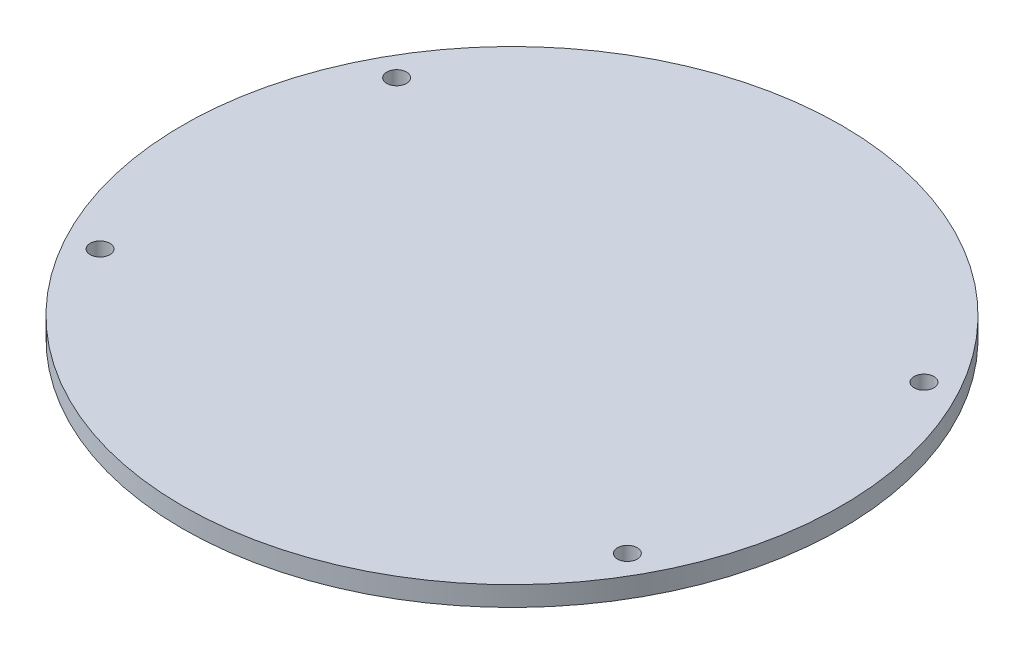
ISO-10303-21;
HEADER;
FILE_DESCRIPTION(('STEP AP214'),'2;1');
FILE_NAME('part.step','',(''),(''),'','','');
FILE_SCHEMA(('AUTOMOTIVE_DESIGN { 1 0 10303 214 1 1 1 1 }'));
ENDSEC;
DATA;
#1=APPLICATION_CONTEXT('core data for automotive mechanical design processes');
#2=APPLICATION_PROTOCOL_DEFINITION('international standard','automotive_design',2000,#1);
#3=PRODUCT_CONTEXT('',#1,'mechanical');
#4=PRODUCT('Part','Part','',(#3));
#5=PRODUCT_RELATED_PRODUCT_CATEGORY('part','',(#4));
#6=PRODUCT_DEFINITION_FORMATION('','',#4);
#7=PRODUCT_DEFINITION_CONTEXT('part definition',#1,'design');
#8=PRODUCT_DEFINITION('design','',#6,#7);
#9=PRODUCT_DEFINITION_SHAPE('','',#8);
#10=(LENGTH_UNIT() NAMED_UNIT(*) SI_UNIT(.MILLI.,.METRE.));
#11=(NAMED_UNIT(*) PLANE_ANGLE_UNIT() SI_UNIT($,.RADIAN.));
#12=(NAMED_UNIT(*) SI_UNIT($,.STERADIAN.) SOLID_ANGLE_UNIT());
#13=UNCERTAINTY_MEASURE_WITH_UNIT(LENGTH_MEASURE(1.E-05),#10,'distance_accuracy_value','');
#14=(GEOMETRIC_REPRESENTATION_CONTEXT(3) GLOBAL_UNCERTAINTY_ASSIGNED_CONTEXT((#13)) GLOBAL_UNIT_ASSIGNED_CONTEXT((#10,
#11,#12)) REPRESENTATION_CONTEXT('',''));
#15=CARTESIAN_POINT('',(0.,0.,0.));
#16=DIRECTION('',(0.,0.,1.));
#17=DIRECTION('',(1.,0.,0.));
#18=AXIS2_PLACEMENT_3D('',#15,#16,#17);
#19=CARTESIAN_POINT('',(0.,3.,0.));
#20=DIRECTION('',(0.,1.,0.));
#21=DIRECTION('',(0.,0.,1.));
#22=AXIS2_PLACEMENT_3D('',#19,#20,#21);
#23=PLANE('',#22);
#24=CARTESIAN_POINT('',(40.,3.,22.5));
#25=DIRECTION('',(0.,1.,0.));
#26=DIRECTION('',(0.,0.,1.));
#27=AXIS2_PLACEMENT_3D('',#24,#25,#26);
#28=CIRCLE('',#27,1.5);
#29=CARTESIAN_POINT('',(40.,3.,24.));
#30=VERTEX_POINT('',#29);
#31=EDGE_CURVE('E56',#30,#30,#28,.T.);
#32=ORIENTED_EDGE('',*,*,#31,.F.);
#33=EDGE_LOOP('',(#32));
#34=FACE_BOUND('',#33,.T.);
#35=CARTESIAN_POINT('',(-40.,3.,-22.5));
#36=DIRECTION('',(0.,1.,0.));
#37=DIRECTION('',(0.,0.,1.));
#38=AXIS2_PLACEMENT_3D('',#35,#36,#37);
#39=CIRCLE('',#38,1.5);
#40=CARTESIAN_POINT('',(-40.,3.,-21.));
#41=VERTEX_POINT('',#40);
#42=EDGE_CURVE('E45',#41,#41,#39,.T.);
#43=ORIENTED_EDGE('',*,*,#42,.F.);
#44=EDGE_LOOP('',(#43));
#45=FACE_BOUND('',#44,.T.);
#46=CARTESIAN_POINT('',(0.,3.,0.));
#47=DIRECTION('',(0.,1.,0.));
#48=DIRECTION('',(0.,0.,1.));
#49=AXIS2_PLACEMENT_3D('',#46,#47,#48);
#50=CIRCLE('',#49,50.);
#51=CARTESIAN_POINT('',(0.,3.,50.));
#52=VERTEX_POINT('',#51);
#53=EDGE_CURVE('E10',#52,#52,#50,.T.);
#54=ORIENTED_EDGE('',*,*,#53,.T.);
#55=EDGE_LOOP('',(#54));
#56=FACE_BOUND('',#55,.T.);
#57=CARTESIAN_POINT('',(40.,3.,-22.5));
#58=DIRECTION('',(0.,1.,0.));
#59=DIRECTION('',(0.,0.,1.));
#60=AXIS2_PLACEMENT_3D('',#57,#58,#59);
#61=CIRCLE('',#60,1.5);
#62=CARTESIAN_POINT('',(40.,3.,-21.));
#63=VERTEX_POINT('',#62);
#64=EDGE_CURVE('E50',#63,#63,#61,.T.);
#65=ORIENTED_EDGE('',*,*,#64,.F.);
#66=EDGE_LOOP('',(#65));
#67=FACE_BOUND('',#66,.T.);
#68=CARTESIAN_POINT('',(-40.,3.,22.5));
#69=DIRECTION('',(0.,1.,0.));
#70=DIRECTION('',(0.,0.,1.));
#71=AXIS2_PLACEMENT_3D('',#68,#69,#70);
#72=CIRCLE('',#71,1.5);
#73=CARTESIAN_POINT('',(-40.,3.,24.));
#74=VERTEX_POINT('',#73);
#75=EDGE_CURVE('E62',#74,#74,#72,.T.);
#76=ORIENTED_EDGE('',*,*,#75,.F.);
#77=EDGE_LOOP('',(#76));
#78=FACE_BOUND('',#77,.T.);
#79=ADVANCED_FACE('F34',(#34,#45,#56,#67,#78),#23,.T.);
#80=CARTESIAN_POINT('',(0.,0.,0.));
#81=DIRECTION('',(0.,1.,0.));
#82=DIRECTION('',(0.,0.,1.));
#83=AXIS2_PLACEMENT_3D('',#80,#81,#82);
#84=PLANE('',#83);
#85=CARTESIAN_POINT('',(0.,0.,0.));
#86=DIRECTION('',(0.,1.,0.));
#87=DIRECTION('',(0.,0.,1.));
#88=AXIS2_PLACEMENT_3D('',#85,#86,#87);
#89=CIRCLE('',#88,50.);
#90=CARTESIAN_POINT('',(0.,0.,50.));
#91=VERTEX_POINT('',#90);
#92=EDGE_CURVE('E38',#91,#91,#89,.T.);
#93=ORIENTED_EDGE('',*,*,#92,.F.);
#94=EDGE_LOOP('',(#93));
#95=FACE_BOUND('',#94,.T.);
#96=CARTESIAN_POINT('',(-40.,0.,-22.5));
#97=DIRECTION('',(0.,1.,0.));
#98=DIRECTION('',(0.,0.,1.));
#99=AXIS2_PLACEMENT_3D('',#96,#97,#98);
#100=CIRCLE('',#99,1.5);
#101=CARTESIAN_POINT('',(-40.,0.,-21.));
#102=VERTEX_POINT('',#101);
#103=EDGE_CURVE('E47',#102,#102,#100,.T.);
#104=ORIENTED_EDGE('',*,*,#103,.T.);
#105=EDGE_LOOP('',(#104));
#106=FACE_BOUND('',#105,.T.);
#107=CARTESIAN_POINT('',(40.,0.,-22.5));
#108=DIRECTION('',(0.,1.,0.));
#109=DIRECTION('',(0.,0.,1.));
#110=AXIS2_PLACEMENT_3D('',#107,#108,#109);
#111=CIRCLE('',#110,1.5);
#112=CARTESIAN_POINT('',(40.,0.,-21.));
#113=VERTEX_POINT('',#112);
#114=EDGE_CURVE('E53',#113,#113,#111,.T.);
#115=ORIENTED_EDGE('',*,*,#114,.T.);
#116=EDGE_LOOP('',(#115));
#117=FACE_BOUND('',#116,.T.);
#118=CARTESIAN_POINT('',(40.,0.,22.5));
#119=DIRECTION('',(0.,1.,0.));
#120=DIRECTION('',(0.,0.,1.));
#121=AXIS2_PLACEMENT_3D('',#118,#119,#120);
#122=CIRCLE('',#121,1.5);
#123=CARTESIAN_POINT('',(40.,0.,24.));
#124=VERTEX_POINT('',#123);
#125=EDGE_CURVE('E59',#124,#124,#122,.T.);
#126=ORIENTED_EDGE('',*,*,#125,.T.);
#127=EDGE_LOOP('',(#126));
#128=FACE_BOUND('',#127,.T.);
#129=CARTESIAN_POINT('',(-40.,0.,22.5));
#130=DIRECTION('',(0.,1.,0.));
#131=DIRECTION('',(0.,0.,1.));
#132=AXIS2_PLACEMENT_3D('',#129,#130,#131);
#133=CIRCLE('',#132,1.5);
#134=CARTESIAN_POINT('',(-40.,0.,24.));
#135=VERTEX_POINT('',#134);
#136=EDGE_CURVE('E65',#135,#135,#133,.T.);
#137=ORIENTED_EDGE('',*,*,#136,.T.);
#138=EDGE_LOOP('',(#137));
#139=FACE_BOUND('',#138,.T.);
#140=ADVANCED_FACE('F75',(#95,#106,#117,#128,#139),#84,.F.);
#141=CARTESIAN_POINT('',(0.,3.,0.));
#142=DIRECTION('',(0.,-1.,0.));
#143=DIRECTION('',(0.,0.,-1.));
#144=AXIS2_PLACEMENT_3D('',#141,#142,#143);
#145=CYLINDRICAL_SURFACE('',#144,50.);
#146=ORIENTED_EDGE('',*,*,#53,.F.);
#147=EDGE_LOOP('',(#146));
#148=FACE_BOUND('',#147,.T.);
#149=ORIENTED_EDGE('',*,*,#92,.T.);
#150=EDGE_LOOP('',(#149));
#151=FACE_BOUND('',#150,.T.);
#152=ADVANCED_FACE('F36',(#148,#151),#145,.T.);
#153=CARTESIAN_POINT('',(-40.,3.,-22.5));
#154=DIRECTION('',(0.,-1.,0.));
#155=DIRECTION('',(0.,0.,-1.));
#156=AXIS2_PLACEMENT_3D('',#153,#154,#155);
#157=CYLINDRICAL_SURFACE('',#156,1.5);
#158=ORIENTED_EDGE('',*,*,#42,.T.);
#159=EDGE_LOOP('',(#158));
#160=FACE_BOUND('',#159,.T.);
#161=ORIENTED_EDGE('',*,*,#103,.F.);
#162=EDGE_LOOP('',(#161));
#163=FACE_BOUND('',#162,.T.);
#164=ADVANCED_FACE('F85',(#160,#163),#157,.F.);
#165=CARTESIAN_POINT('',(40.,3.,-22.5));
#166=DIRECTION('',(0.,-1.,0.));
#167=DIRECTION('',(0.,0.,-1.));
#168=AXIS2_PLACEMENT_3D('',#165,#166,#167);
#169=CYLINDRICAL_SURFACE('',#168,1.5);
#170=ORIENTED_EDGE('',*,*,#64,.T.);
#171=EDGE_LOOP('',(#170));
#172=FACE_BOUND('',#171,.T.);
#173=ORIENTED_EDGE('',*,*,#114,.F.);
#174=EDGE_LOOP('',(#173));
#175=FACE_BOUND('',#174,.T.);
#176=ADVANCED_FACE('F88',(#172,#175),#169,.F.);
#177=CARTESIAN_POINT('',(40.,3.,22.5));
#178=DIRECTION('',(0.,-1.,0.));
#179=DIRECTION('',(0.,0.,-1.));
#180=AXIS2_PLACEMENT_3D('',#177,#178,#179);
#181=CYLINDRICAL_SURFACE('',#180,1.5);
#182=ORIENTED_EDGE('',*,*,#31,.T.);
#183=EDGE_LOOP('',(#182));
#184=FACE_BOUND('',#183,.T.);
#185=ORIENTED_EDGE('',*,*,#125,.F.);
#186=EDGE_LOOP('',(#185));
#187=FACE_BOUND('',#186,.T.);
#188=ADVANCED_FACE('F92',(#184,#187),#181,.F.);
#189=CARTESIAN_POINT('',(-40.,3.,22.5));
#190=DIRECTION('',(0.,-1.,0.));
#191=DIRECTION('',(0.,0.,-1.));
#192=AXIS2_PLACEMENT_3D('',#189,#190,#191);
#193=CYLINDRICAL_SURFACE('',#192,1.5);
#194=ORIENTED_EDGE('',*,*,#75,.T.);
#195=EDGE_LOOP('',(#194));
#196=FACE_BOUND('',#195,.T.);
#197=ORIENTED_EDGE('',*,*,#136,.F.);
#198=EDGE_LOOP('',(#197));
#199=FACE_BOUND('',#198,.T.);
#200=ADVANCED_FACE('F71',(#196,#199),#193,.F.);
#201=CLOSED_SHELL('',(#79,#140,#152,#164,#176,#188,#200));
#202=MANIFOLD_SOLID_BREP('B2',#201);
#203=ADVANCED_BREP_SHAPE_REPRESENTATION('',(#18,#202),#14);
#204=SHAPE_DEFINITION_REPRESENTATION(#9,#203);
ENDSEC;
END-ISO-10303-21;
